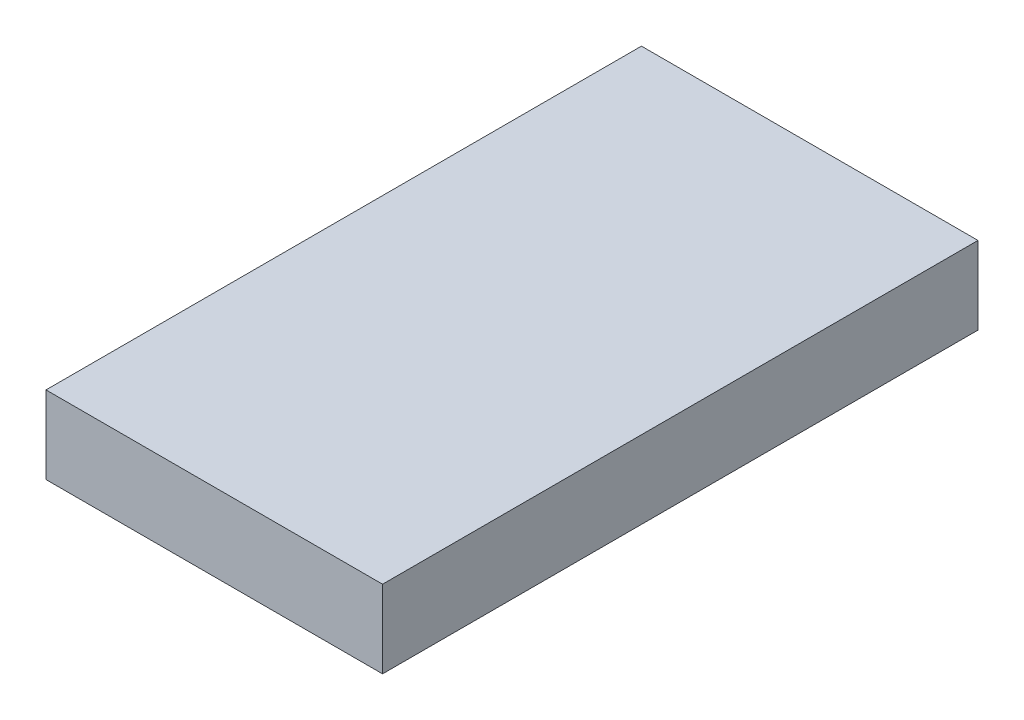
ISO-10303-21;
HEADER;
FILE_DESCRIPTION(('STEP AP214'),'2;1');
FILE_NAME('part.step','',(''),(''),'','','');
FILE_SCHEMA(('AUTOMOTIVE_DESIGN { 1 0 10303 214 1 1 1 1 }'));
ENDSEC;
DATA;
#1=APPLICATION_CONTEXT('core data for automotive mechanical design processes');
#2=APPLICATION_PROTOCOL_DEFINITION('international standard','automotive_design',2000,#1);
#3=PRODUCT_CONTEXT('',#1,'mechanical');
#4=PRODUCT('Part','Part','',(#3));
#5=PRODUCT_RELATED_PRODUCT_CATEGORY('part','',(#4));
#6=PRODUCT_DEFINITION_FORMATION('','',#4);
#7=PRODUCT_DEFINITION_CONTEXT('part definition',#1,'design');
#8=PRODUCT_DEFINITION('design','',#6,#7);
#9=PRODUCT_DEFINITION_SHAPE('','',#8);
#10=(LENGTH_UNIT() NAMED_UNIT(*) SI_UNIT(.MILLI.,.METRE.));
#11=(NAMED_UNIT(*) PLANE_ANGLE_UNIT() SI_UNIT($,.RADIAN.));
#12=(NAMED_UNIT(*) SI_UNIT($,.STERADIAN.) SOLID_ANGLE_UNIT());
#13=UNCERTAINTY_MEASURE_WITH_UNIT(LENGTH_MEASURE(1.E-05),#10,'distance_accuracy_value','');
#14=(GEOMETRIC_REPRESENTATION_CONTEXT(3) GLOBAL_UNCERTAINTY_ASSIGNED_CONTEXT((#13)) GLOBAL_UNIT_ASSIGNED_CONTEXT((#10,
#11,#12)) REPRESENTATION_CONTEXT('',''));
#15=CARTESIAN_POINT('',(0.,0.,0.));
#16=DIRECTION('',(0.,0.,1.));
#17=DIRECTION('',(1.,0.,0.));
#18=AXIS2_PLACEMENT_3D('',#15,#16,#17);
#19=CARTESIAN_POINT('',(-82.55,44.45,158.75));
#20=DIRECTION('',(1.,0.,0.));
#21=DIRECTION('',(0.,0.,-1.));
#22=AXIS2_PLACEMENT_3D('',#19,#20,#21);
#23=PLANE('',#22);
#24=DIRECTION('',(0.,0.,1.));
#25=VECTOR('',#24,1.);
#26=CARTESIAN_POINT('',(-82.55,6.35,158.75));
#27=LINE('',#26,#25);
#28=CARTESIAN_POINT('',(-82.55,6.35,-133.35));
#29=VERTEX_POINT('',#28);
#30=CARTESIAN_POINT('',(-82.55,6.35,158.75));
#31=VERTEX_POINT('',#30);
#32=EDGE_CURVE('E102',#29,#31,#27,.T.);
#33=ORIENTED_EDGE('',*,*,#32,.T.);
#34=DIRECTION('',(0.,-1.,0.));
#35=VECTOR('',#34,1.);
#36=CARTESIAN_POINT('',(-82.55,44.45,158.75));
#37=LINE('',#36,#35);
#38=CARTESIAN_POINT('',(-82.55,44.45,158.75));
#39=VERTEX_POINT('',#38);
#40=EDGE_CURVE('E11',#39,#31,#37,.T.);
#41=ORIENTED_EDGE('',*,*,#40,.F.);
#42=DIRECTION('',(0.,0.,1.));
#43=VECTOR('',#42,1.);
#44=CARTESIAN_POINT('',(-82.55,44.45,158.75));
#45=LINE('',#44,#43);
#46=CARTESIAN_POINT('',(-82.55,44.45,-133.35));
#47=VERTEX_POINT('',#46);
#48=EDGE_CURVE('E90',#47,#39,#45,.T.);
#49=ORIENTED_EDGE('',*,*,#48,.F.);
#50=DIRECTION('',(0.,-1.,0.));
#51=VECTOR('',#50,1.);
#52=CARTESIAN_POINT('',(-82.55,44.45,-133.35));
#53=LINE('',#52,#51);
#54=EDGE_CURVE('E98',#47,#29,#53,.T.);
#55=ORIENTED_EDGE('',*,*,#54,.T.);
#56=EDGE_LOOP('',(#33,#41,#49,#55));
#57=FACE_BOUND('',#56,.T.);
#58=ADVANCED_FACE('F39',(#57),#23,.F.);
#59=CARTESIAN_POINT('',(-82.55,44.45,158.75));
#60=DIRECTION('',(0.,0.,-1.));
#61=DIRECTION('',(-1.,0.,0.));
#62=AXIS2_PLACEMENT_3D('',#59,#60,#61);
#63=PLANE('',#62);
#64=DIRECTION('',(1.,0.,0.));
#65=VECTOR('',#64,1.);
#66=CARTESIAN_POINT('',(-82.55,6.35,158.75));
#67=LINE('',#66,#65);
#68=CARTESIAN_POINT('',(82.55,6.35,158.75));
#69=VERTEX_POINT('',#68);
#70=EDGE_CURVE('E94',#31,#69,#67,.T.);
#71=ORIENTED_EDGE('',*,*,#70,.T.);
#72=DIRECTION('',(0.,-1.,0.));
#73=VECTOR('',#72,1.);
#74=CARTESIAN_POINT('',(82.55,44.45,158.75));
#75=LINE('',#74,#73);
#76=CARTESIAN_POINT('',(82.55,44.45,158.75));
#77=VERTEX_POINT('',#76);
#78=EDGE_CURVE('E47',#77,#69,#75,.T.);
#79=ORIENTED_EDGE('',*,*,#78,.F.);
#80=DIRECTION('',(1.,0.,0.));
#81=VECTOR('',#80,1.);
#82=CARTESIAN_POINT('',(-82.55,44.45,158.75));
#83=LINE('',#82,#81);
#84=EDGE_CURVE('E85',#39,#77,#83,.T.);
#85=ORIENTED_EDGE('',*,*,#84,.F.);
#86=ORIENTED_EDGE('',*,*,#40,.T.);
#87=EDGE_LOOP('',(#71,#79,#85,#86));
#88=FACE_BOUND('',#87,.T.);
#89=ADVANCED_FACE('F93',(#88),#63,.F.);
#90=CARTESIAN_POINT('',(82.55,44.45,158.75));
#91=DIRECTION('',(-1.,0.,0.));
#92=DIRECTION('',(0.,0.,1.));
#93=AXIS2_PLACEMENT_3D('',#90,#91,#92);
#94=PLANE('',#93);
#95=DIRECTION('',(0.,0.,-1.));
#96=VECTOR('',#95,1.);
#97=CARTESIAN_POINT('',(82.55,6.35,158.75));
#98=LINE('',#97,#96);
#99=CARTESIAN_POINT('',(82.55,6.35,-133.35));
#100=VERTEX_POINT('',#99);
#101=EDGE_CURVE('E72',#69,#100,#98,.T.);
#102=ORIENTED_EDGE('',*,*,#101,.T.);
#103=DIRECTION('',(0.,-1.,0.));
#104=VECTOR('',#103,1.);
#105=CARTESIAN_POINT('',(82.55,44.45,-133.35));
#106=LINE('',#105,#104);
#107=CARTESIAN_POINT('',(82.55,44.45,-133.35));
#108=VERTEX_POINT('',#107);
#109=EDGE_CURVE('E95',#108,#100,#106,.T.);
#110=ORIENTED_EDGE('',*,*,#109,.F.);
#111=DIRECTION('',(0.,0.,-1.));
#112=VECTOR('',#111,1.);
#113=CARTESIAN_POINT('',(82.55,44.45,158.75));
#114=LINE('',#113,#112);
#115=EDGE_CURVE('E88',#77,#108,#114,.T.);
#116=ORIENTED_EDGE('',*,*,#115,.F.);
#117=ORIENTED_EDGE('',*,*,#78,.T.);
#118=EDGE_LOOP('',(#102,#110,#116,#117));
#119=FACE_BOUND('',#118,.T.);
#120=ADVANCED_FACE('F96',(#119),#94,.F.);
#121=CARTESIAN_POINT('',(-82.55,44.45,-133.35));
#122=DIRECTION('',(0.,0.,1.));
#123=DIRECTION('',(1.,0.,0.));
#124=AXIS2_PLACEMENT_3D('',#121,#122,#123);
#125=PLANE('',#124);
#126=DIRECTION('',(-1.,0.,0.));
#127=VECTOR('',#126,1.);
#128=CARTESIAN_POINT('',(-82.55,6.35,-133.35));
#129=LINE('',#128,#127);
#130=EDGE_CURVE('E78',#100,#29,#129,.T.);
#131=ORIENTED_EDGE('',*,*,#130,.T.);
#132=ORIENTED_EDGE('',*,*,#54,.F.);
#133=DIRECTION('',(-1.,0.,0.));
#134=VECTOR('',#133,1.);
#135=CARTESIAN_POINT('',(-82.55,44.45,-133.35));
#136=LINE('',#135,#134);
#137=EDGE_CURVE('E55',#108,#47,#136,.T.);
#138=ORIENTED_EDGE('',*,*,#137,.F.);
#139=ORIENTED_EDGE('',*,*,#109,.T.);
#140=EDGE_LOOP('',(#131,#132,#138,#139));
#141=FACE_BOUND('',#140,.T.);
#142=ADVANCED_FACE('F109',(#141),#125,.F.);
#143=CARTESIAN_POINT('',(0.,44.45,0.));
#144=DIRECTION('',(0.,-1.,0.));
#145=DIRECTION('',(0.,0.,-1.));
#146=AXIS2_PLACEMENT_3D('',#143,#144,#145);
#147=PLANE('',#146);
#148=ORIENTED_EDGE('',*,*,#48,.T.);
#149=ORIENTED_EDGE('',*,*,#84,.T.);
#150=ORIENTED_EDGE('',*,*,#115,.T.);
#151=ORIENTED_EDGE('',*,*,#137,.T.);
#152=EDGE_LOOP('',(#148,#149,#150,#151));
#153=FACE_BOUND('',#152,.T.);
#154=ADVANCED_FACE('F86',(#153),#147,.F.);
#155=CARTESIAN_POINT('',(0.,6.35,0.));
#156=DIRECTION('',(0.,-1.,0.));
#157=DIRECTION('',(0.,0.,-1.));
#158=AXIS2_PLACEMENT_3D('',#155,#156,#157);
#159=PLANE('',#158);
#160=ORIENTED_EDGE('',*,*,#32,.F.);
#161=ORIENTED_EDGE('',*,*,#130,.F.);
#162=ORIENTED_EDGE('',*,*,#101,.F.);
#163=ORIENTED_EDGE('',*,*,#70,.F.);
#164=EDGE_LOOP('',(#160,#161,#162,#163));
#165=FACE_BOUND('',#164,.T.);
#166=ADVANCED_FACE('F112',(#165),#159,.T.);
#167=CLOSED_SHELL('',(#58,#89,#120,#142,#154,#166));
#168=MANIFOLD_SOLID_BREP('B2',#167);
#169=ADVANCED_BREP_SHAPE_REPRESENTATION('',(#18,#168),#14);
#170=SHAPE_DEFINITION_REPRESENTATION(#9,#169);
ENDSEC;
END-ISO-10303-21;
